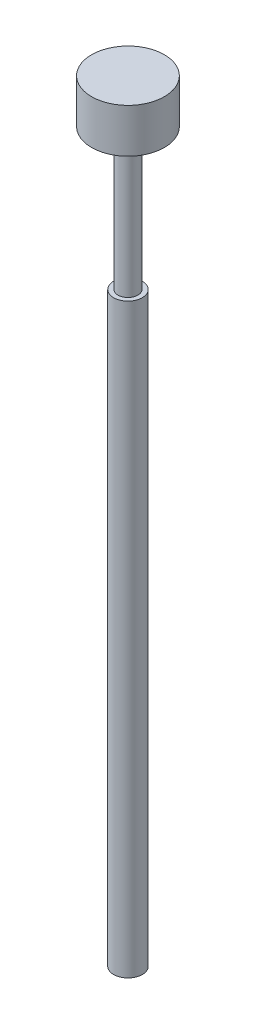
ISO-10303-21;
HEADER;
FILE_DESCRIPTION(('STEP AP214'),'2;1');
FILE_NAME('part.step','',(''),(''),'','','');
FILE_SCHEMA(('AUTOMOTIVE_DESIGN { 1 0 10303 214 1 1 1 1 }'));
ENDSEC;
DATA;
#1=APPLICATION_CONTEXT('core data for automotive mechanical design processes');
#2=APPLICATION_PROTOCOL_DEFINITION('international standard','automotive_design',2000,#1);
#3=PRODUCT_CONTEXT('',#1,'mechanical');
#4=PRODUCT('Part','Part','',(#3));
#5=PRODUCT_RELATED_PRODUCT_CATEGORY('part','',(#4));
#6=PRODUCT_DEFINITION_FORMATION('','',#4);
#7=PRODUCT_DEFINITION_CONTEXT('part definition',#1,'design');
#8=PRODUCT_DEFINITION('design','',#6,#7);
#9=PRODUCT_DEFINITION_SHAPE('','',#8);
#10=(LENGTH_UNIT() NAMED_UNIT(*) SI_UNIT(.MILLI.,.METRE.));
#11=(NAMED_UNIT(*) PLANE_ANGLE_UNIT() SI_UNIT($,.RADIAN.));
#12=(NAMED_UNIT(*) SI_UNIT($,.STERADIAN.) SOLID_ANGLE_UNIT());
#13=UNCERTAINTY_MEASURE_WITH_UNIT(LENGTH_MEASURE(1.E-05),#10,'distance_accuracy_value','');
#14=(GEOMETRIC_REPRESENTATION_CONTEXT(3) GLOBAL_UNCERTAINTY_ASSIGNED_CONTEXT((#13)) GLOBAL_UNIT_ASSIGNED_CONTEXT((#10,
#11,#12)) REPRESENTATION_CONTEXT('',''));
#15=CARTESIAN_POINT('',(0.,0.,0.));
#16=DIRECTION('',(0.,0.,1.));
#17=DIRECTION('',(1.,0.,0.));
#18=AXIS2_PLACEMENT_3D('',#15,#16,#17);
#19=CARTESIAN_POINT('',(0.,33.,0.));
#20=DIRECTION('',(0.,-1.,0.));
#21=DIRECTION('',(0.,0.,-1.));
#22=AXIS2_PLACEMENT_3D('',#19,#20,#21);
#23=CYLINDRICAL_SURFACE('',#22,0.65);
#24=CARTESIAN_POINT('',(0.,0.,0.));
#25=DIRECTION('',(0.,1.,0.));
#26=DIRECTION('',(0.,0.,1.));
#27=AXIS2_PLACEMENT_3D('',#24,#25,#26);
#28=CIRCLE('',#27,0.65);
#29=CARTESIAN_POINT('',(0.,0.,0.65));
#30=VERTEX_POINT('',#29);
#31=EDGE_CURVE('E10',#30,#30,#28,.T.);
#32=ORIENTED_EDGE('',*,*,#31,.T.);
#33=EDGE_LOOP('',(#32));
#34=FACE_BOUND('',#33,.T.);
#35=CARTESIAN_POINT('',(0.,26.6,0.));
#36=DIRECTION('',(0.,1.,0.));
#37=DIRECTION('',(0.,0.,1.));
#38=AXIS2_PLACEMENT_3D('',#35,#36,#37);
#39=CIRCLE('',#38,0.65);
#40=CARTESIAN_POINT('',(0.,26.6,0.65));
#41=VERTEX_POINT('',#40);
#42=EDGE_CURVE('E50',#41,#41,#39,.T.);
#43=ORIENTED_EDGE('',*,*,#42,.F.);
#44=EDGE_LOOP('',(#43));
#45=FACE_BOUND('',#44,.T.);
#46=ADVANCED_FACE('F43',(#34,#45),#23,.T.);
#47=CARTESIAN_POINT('',(0.,0.,0.));
#48=DIRECTION('',(0.,1.,0.));
#49=DIRECTION('',(0.,0.,1.));
#50=AXIS2_PLACEMENT_3D('',#47,#48,#49);
#51=PLANE('',#50);
#52=ORIENTED_EDGE('',*,*,#31,.F.);
#53=EDGE_LOOP('',(#52));
#54=FACE_BOUND('',#53,.T.);
#55=ADVANCED_FACE('F93',(#54),#51,.F.);
#56=CARTESIAN_POINT('',(0.,26.6,0.));
#57=DIRECTION('',(0.,1.,0.));
#58=DIRECTION('',(0.,0.,1.));
#59=AXIS2_PLACEMENT_3D('',#56,#57,#58);
#60=PLANE('',#59);
#61=CARTESIAN_POINT('',(0.,26.6,0.));
#62=DIRECTION('',(0.,1.,0.));
#63=DIRECTION('',(0.,0.,1.));
#64=AXIS2_PLACEMENT_3D('',#61,#62,#63);
#65=CIRCLE('',#64,0.45);
#66=CARTESIAN_POINT('',(0.,26.6,0.45));
#67=VERTEX_POINT('',#66);
#68=EDGE_CURVE('E55',#67,#67,#65,.T.);
#69=ORIENTED_EDGE('',*,*,#68,.F.);
#70=EDGE_LOOP('',(#69));
#71=FACE_BOUND('',#70,.T.);
#72=ORIENTED_EDGE('',*,*,#42,.T.);
#73=EDGE_LOOP('',(#72));
#74=FACE_BOUND('',#73,.T.);
#75=ADVANCED_FACE('F98',(#71,#74),#60,.T.);
#76=CARTESIAN_POINT('',(0.,26.6,0.));
#77=DIRECTION('',(0.,1.,0.));
#78=DIRECTION('',(0.,0.,1.));
#79=AXIS2_PLACEMENT_3D('',#76,#77,#78);
#80=CYLINDRICAL_SURFACE('',#79,0.45);
#81=ORIENTED_EDGE('',*,*,#68,.T.);
#82=EDGE_LOOP('',(#81));
#83=FACE_BOUND('',#82,.T.);
#84=CARTESIAN_POINT('',(0.,33.,0.));
#85=DIRECTION('',(0.,1.,0.));
#86=DIRECTION('',(0.,0.,1.));
#87=AXIS2_PLACEMENT_3D('',#84,#85,#86);
#88=CIRCLE('',#87,0.45);
#89=CARTESIAN_POINT('',(0.,33.,0.45));
#90=VERTEX_POINT('',#89);
#91=EDGE_CURVE('E60',#90,#90,#88,.T.);
#92=ORIENTED_EDGE('',*,*,#91,.F.);
#93=EDGE_LOOP('',(#92));
#94=FACE_BOUND('',#93,.T.);
#95=ADVANCED_FACE('F80',(#83,#94),#80,.T.);
#96=CARTESIAN_POINT('',(0.,35.,0.));
#97=DIRECTION('',(0.,-1.,0.));
#98=DIRECTION('',(0.,0.,-1.));
#99=AXIS2_PLACEMENT_3D('',#96,#97,#98);
#100=CYLINDRICAL_SURFACE('',#99,1.65);
#101=CARTESIAN_POINT('',(0.,35.,0.));
#102=DIRECTION('',(0.,1.,0.));
#103=DIRECTION('',(0.,0.,1.));
#104=AXIS2_PLACEMENT_3D('',#101,#102,#103);
#105=CIRCLE('',#104,1.65);
#106=CARTESIAN_POINT('',(0.,35.,1.65));
#107=VERTEX_POINT('',#106);
#108=EDGE_CURVE('E65',#107,#107,#105,.T.);
#109=ORIENTED_EDGE('',*,*,#108,.F.);
#110=EDGE_LOOP('',(#109));
#111=FACE_BOUND('',#110,.T.);
#112=CARTESIAN_POINT('',(0.,33.,0.));
#113=DIRECTION('',(0.,1.,0.));
#114=DIRECTION('',(0.,0.,1.));
#115=AXIS2_PLACEMENT_3D('',#112,#113,#114);
#116=CIRCLE('',#115,1.65);
#117=CARTESIAN_POINT('',(0.,33.,1.65));
#118=VERTEX_POINT('',#117);
#119=EDGE_CURVE('E67',#118,#118,#116,.T.);
#120=ORIENTED_EDGE('',*,*,#119,.T.);
#121=EDGE_LOOP('',(#120));
#122=FACE_BOUND('',#121,.T.);
#123=ADVANCED_FACE('F77',(#111,#122),#100,.T.);
#124=CARTESIAN_POINT('',(0.,35.,0.));
#125=DIRECTION('',(0.,1.,0.));
#126=DIRECTION('',(0.,0.,1.));
#127=AXIS2_PLACEMENT_3D('',#124,#125,#126);
#128=PLANE('',#127);
#129=ORIENTED_EDGE('',*,*,#108,.T.);
#130=EDGE_LOOP('',(#129));
#131=FACE_BOUND('',#130,.T.);
#132=ADVANCED_FACE('F75',(#131),#128,.T.);
#133=CARTESIAN_POINT('',(0.,33.,0.));
#134=DIRECTION('',(0.,1.,0.));
#135=DIRECTION('',(0.,0.,1.));
#136=AXIS2_PLACEMENT_3D('',#133,#134,#135);
#137=PLANE('',#136);
#138=ORIENTED_EDGE('',*,*,#91,.T.);
#139=EDGE_LOOP('',(#138));
#140=FACE_BOUND('',#139,.T.);
#141=ORIENTED_EDGE('',*,*,#119,.F.);
#142=EDGE_LOOP('',(#141));
#143=FACE_BOUND('',#142,.T.);
#144=ADVANCED_FACE('F84',(#140,#143),#137,.F.);
#145=CLOSED_SHELL('',(#46,#55,#75,#95,#123,#132,#144));
#146=MANIFOLD_SOLID_BREP('B2',#145);
#147=ADVANCED_BREP_SHAPE_REPRESENTATION('',(#18,#146),#14);
#148=SHAPE_DEFINITION_REPRESENTATION(#9,#147);
ENDSEC;
END-ISO-10303-21;
